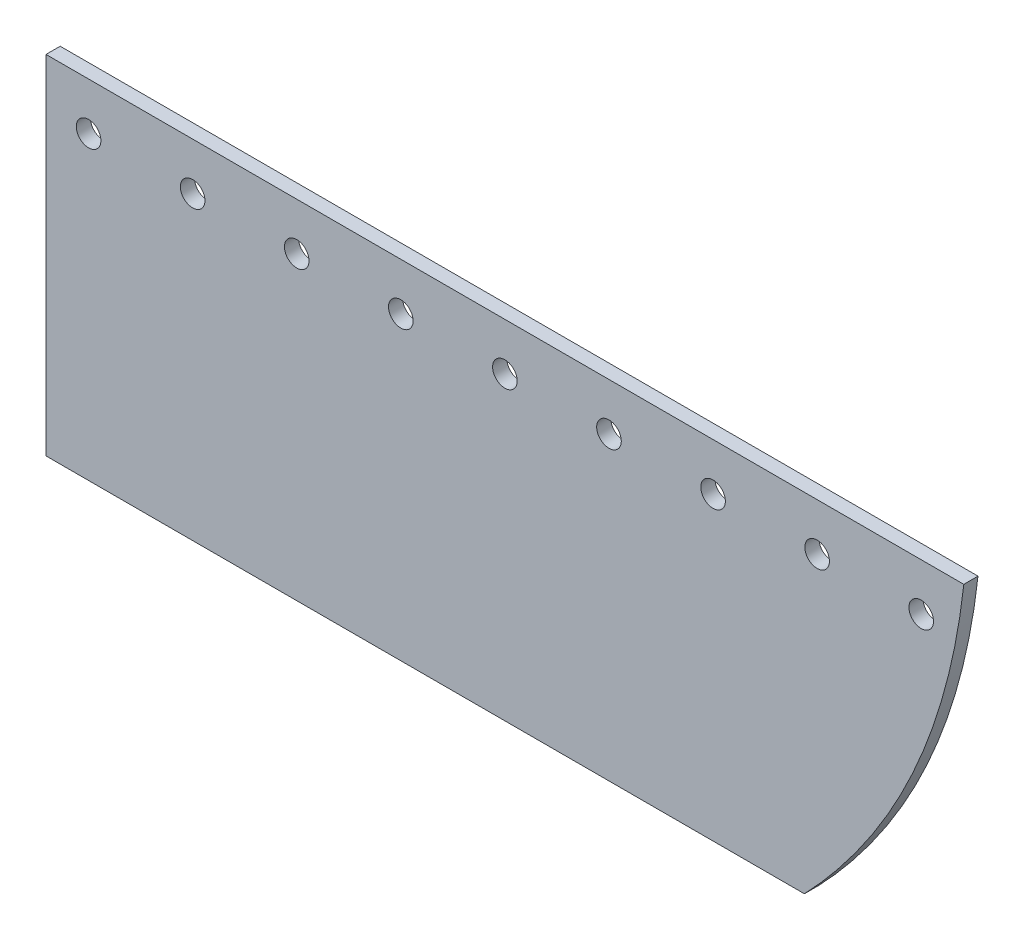
ISO-10303-21;
HEADER;
FILE_DESCRIPTION(('STEP AP214'),'2;1');
FILE_NAME('part.step','',(''),(''),'','','');
FILE_SCHEMA(('AUTOMOTIVE_DESIGN { 1 0 10303 214 1 1 1 1 }'));
ENDSEC;
DATA;
#1=APPLICATION_CONTEXT('core data for automotive mechanical design processes');
#2=APPLICATION_PROTOCOL_DEFINITION('international standard','automotive_design',2000,#1);
#3=PRODUCT_CONTEXT('',#1,'mechanical');
#4=PRODUCT('Part','Part','',(#3));
#5=PRODUCT_RELATED_PRODUCT_CATEGORY('part','',(#4));
#6=PRODUCT_DEFINITION_FORMATION('','',#4);
#7=PRODUCT_DEFINITION_CONTEXT('part definition',#1,'design');
#8=PRODUCT_DEFINITION('design','',#6,#7);
#9=PRODUCT_DEFINITION_SHAPE('','',#8);
#10=(LENGTH_UNIT() NAMED_UNIT(*) SI_UNIT(.MILLI.,.METRE.));
#11=(NAMED_UNIT(*) PLANE_ANGLE_UNIT() SI_UNIT($,.RADIAN.));
#12=(NAMED_UNIT(*) SI_UNIT($,.STERADIAN.) SOLID_ANGLE_UNIT());
#13=UNCERTAINTY_MEASURE_WITH_UNIT(LENGTH_MEASURE(1.E-05),#10,'distance_accuracy_value','');
#14=(GEOMETRIC_REPRESENTATION_CONTEXT(3) GLOBAL_UNCERTAINTY_ASSIGNED_CONTEXT((#13)) GLOBAL_UNIT_ASSIGNED_CONTEXT((#10,
#11,#12)) REPRESENTATION_CONTEXT('',''));
#15=CARTESIAN_POINT('',(0.,0.,0.));
#16=DIRECTION('',(0.,0.,1.));
#17=DIRECTION('',(1.,0.,0.));
#18=AXIS2_PLACEMENT_3D('',#15,#16,#17);
#19=CARTESIAN_POINT('',(-100.,36.75,3.));
#20=DIRECTION('',(0.,-1.,0.));
#21=DIRECTION('',(0.,0.,-1.));
#22=AXIS2_PLACEMENT_3D('',#19,#20,#21);
#23=PLANE('',#22);
#24=DIRECTION('',(-1.,0.,0.));
#25=VECTOR('',#24,1.);
#26=CARTESIAN_POINT('',(-100.,36.75,0.));
#27=LINE('',#26,#25);
#28=CARTESIAN_POINT('',(97.,36.75,0.));
#29=VERTEX_POINT('',#28);
#30=CARTESIAN_POINT('',(-97.,36.75,0.));
#31=VERTEX_POINT('',#30);
#32=EDGE_CURVE('E177',#29,#31,#27,.T.);
#33=ORIENTED_EDGE('',*,*,#32,.T.);
#34=DIRECTION('',(0.,0.,1.));
#35=VECTOR('',#34,1.);
#36=CARTESIAN_POINT('',(-97.,36.75,0.));
#37=LINE('',#36,#35);
#38=CARTESIAN_POINT('',(-97.,36.75,3.));
#39=VERTEX_POINT('',#38);
#40=EDGE_CURVE('E56',#31,#39,#37,.T.);
#41=ORIENTED_EDGE('',*,*,#40,.T.);
#42=DIRECTION('',(-1.,0.,0.));
#43=VECTOR('',#42,1.);
#44=CARTESIAN_POINT('',(-100.,36.75,3.));
#45=LINE('',#44,#43);
#46=CARTESIAN_POINT('',(97.,36.75,3.));
#47=VERTEX_POINT('',#46);
#48=EDGE_CURVE('E41',#47,#39,#45,.T.);
#49=ORIENTED_EDGE('',*,*,#48,.F.);
#50=DIRECTION('',(0.,0.,1.));
#51=VECTOR('',#50,1.);
#52=CARTESIAN_POINT('',(97.,36.75,0.));
#53=LINE('',#52,#51);
#54=EDGE_CURVE('E68',#29,#47,#53,.T.);
#55=ORIENTED_EDGE('',*,*,#54,.F.);
#56=EDGE_LOOP('',(#33,#41,#49,#55));
#57=FACE_BOUND('',#56,.T.);
#58=ADVANCED_FACE('F38',(#57),#23,.F.);
#59=CARTESIAN_POINT('',(-100.,-36.75,3.));
#60=DIRECTION('',(0.,1.,0.));
#61=DIRECTION('',(0.,0.,1.));
#62=AXIS2_PLACEMENT_3D('',#59,#60,#61);
#63=PLANE('',#62);
#64=DIRECTION('',(1.,0.,0.));
#65=VECTOR('',#64,1.);
#66=CARTESIAN_POINT('',(-100.,-36.75,0.));
#67=LINE('',#66,#65);
#68=CARTESIAN_POINT('',(-97.,-36.75,0.));
#69=VERTEX_POINT('',#68);
#70=CARTESIAN_POINT('',(63.3032073547046,-36.75,0.));
#71=VERTEX_POINT('',#70);
#72=EDGE_CURVE('E89',#69,#71,#67,.T.);
#73=ORIENTED_EDGE('',*,*,#72,.T.);
#74=DIRECTION('',(0.,0.,1.));
#75=VECTOR('',#74,1.);
#76=CARTESIAN_POINT('',(63.3032073547046,-36.75,0.));
#77=LINE('',#76,#75);
#78=CARTESIAN_POINT('',(63.3032073547046,-36.75,3.));
#79=VERTEX_POINT('',#78);
#80=EDGE_CURVE('E76',#71,#79,#77,.T.);
#81=ORIENTED_EDGE('',*,*,#80,.T.);
#82=DIRECTION('',(1.,0.,0.));
#83=VECTOR('',#82,1.);
#84=CARTESIAN_POINT('',(-100.,-36.75,3.));
#85=LINE('',#84,#83);
#86=CARTESIAN_POINT('',(-97.,-36.75,3.));
#87=VERTEX_POINT('',#86);
#88=EDGE_CURVE('E11',#87,#79,#85,.T.);
#89=ORIENTED_EDGE('',*,*,#88,.F.);
#90=DIRECTION('',(0.,0.,1.));
#91=VECTOR('',#90,1.);
#92=CARTESIAN_POINT('',(-97.,-36.75,0.));
#93=LINE('',#92,#91);
#94=EDGE_CURVE('E107',#69,#87,#93,.T.);
#95=ORIENTED_EDGE('',*,*,#94,.F.);
#96=EDGE_LOOP('',(#73,#81,#89,#95));
#97=FACE_BOUND('',#96,.T.);
#98=ADVANCED_FACE('F86',(#97),#63,.F.);
#99=CARTESIAN_POINT('',(0.,0.,3.));
#100=DIRECTION('',(0.,0.,1.));
#101=DIRECTION('',(1.,0.,0.));
#102=AXIS2_PLACEMENT_3D('',#99,#100,#101);
#103=PLANE('',#102);
#104=CARTESIAN_POINT('',(97.,36.75,3.));
#105=CARTESIAN_POINT('',(92.1890941569211,-6.5258786783424,3.));
#106=CARTESIAN_POINT('',(63.3032073547046,-36.75,3.));
#107=B_SPLINE_CURVE_WITH_KNOTS('',2,(#104,#105,#106),.UNSPECIFIED.,.F.,.F.,(3,3),(0.,1.),.UNSPECIFIED.);
#108=EDGE_CURVE('E73',#47,#79,#107,.T.);
#109=ORIENTED_EDGE('',*,*,#108,.F.);
#110=ORIENTED_EDGE('',*,*,#48,.T.);
#111=DIRECTION('',(0.,1.,0.));
#112=VECTOR('',#111,1.);
#113=CARTESIAN_POINT('',(-97.,0.,3.));
#114=LINE('',#113,#112);
#115=EDGE_CURVE('E96',#87,#39,#114,.T.);
#116=ORIENTED_EDGE('',*,*,#115,.F.);
#117=ORIENTED_EDGE('',*,*,#88,.T.);
#118=EDGE_LOOP('',(#109,#110,#116,#117));
#119=FACE_BOUND('',#118,.T.);
#120=CARTESIAN_POINT('',(-22.,26.75,3.));
#121=DIRECTION('',(0.,0.,1.));
#122=DIRECTION('',(1.,0.,0.));
#123=AXIS2_PLACEMENT_3D('',#120,#121,#122);
#124=CIRCLE('',#123,2.6);
#125=CARTESIAN_POINT('',(-19.4,26.75,3.));
#126=VERTEX_POINT('',#125);
#127=EDGE_CURVE('E120',#126,#126,#124,.T.);
#128=ORIENTED_EDGE('',*,*,#127,.F.);
#129=EDGE_LOOP('',(#128));
#130=FACE_BOUND('',#129,.T.);
#131=CARTESIAN_POINT('',(88.,26.75,3.));
#132=DIRECTION('',(0.,0.,1.));
#133=DIRECTION('',(1.,0.,0.));
#134=AXIS2_PLACEMENT_3D('',#131,#132,#133);
#135=CIRCLE('',#134,2.6);
#136=CARTESIAN_POINT('',(90.6,26.75,3.));
#137=VERTEX_POINT('',#136);
#138=EDGE_CURVE('E131',#137,#137,#135,.T.);
#139=ORIENTED_EDGE('',*,*,#138,.F.);
#140=EDGE_LOOP('',(#139));
#141=FACE_BOUND('',#140,.T.);
#142=CARTESIAN_POINT('',(66.,26.75,3.));
#143=DIRECTION('',(0.,0.,1.));
#144=DIRECTION('',(1.,0.,0.));
#145=AXIS2_PLACEMENT_3D('',#142,#143,#144);
#146=CIRCLE('',#145,2.6);
#147=CARTESIAN_POINT('',(68.6,26.75,3.));
#148=VERTEX_POINT('',#147);
#149=EDGE_CURVE('E140',#148,#148,#146,.T.);
#150=ORIENTED_EDGE('',*,*,#149,.F.);
#151=EDGE_LOOP('',(#150));
#152=FACE_BOUND('',#151,.T.);
#153=CARTESIAN_POINT('',(44.,26.75,3.));
#154=DIRECTION('',(0.,0.,1.));
#155=DIRECTION('',(1.,0.,0.));
#156=AXIS2_PLACEMENT_3D('',#153,#154,#155);
#157=CIRCLE('',#156,2.6);
#158=CARTESIAN_POINT('',(46.6,26.75,3.));
#159=VERTEX_POINT('',#158);
#160=EDGE_CURVE('E147',#159,#159,#157,.T.);
#161=ORIENTED_EDGE('',*,*,#160,.F.);
#162=EDGE_LOOP('',(#161));
#163=FACE_BOUND('',#162,.T.);
#164=CARTESIAN_POINT('',(-44.,26.75,3.));
#165=DIRECTION('',(0.,0.,1.));
#166=DIRECTION('',(1.,0.,0.));
#167=AXIS2_PLACEMENT_3D('',#164,#165,#166);
#168=CIRCLE('',#167,2.6);
#169=CARTESIAN_POINT('',(-41.4,26.75,3.));
#170=VERTEX_POINT('',#169);
#171=EDGE_CURVE('E111',#170,#170,#168,.T.);
#172=ORIENTED_EDGE('',*,*,#171,.F.);
#173=EDGE_LOOP('',(#172));
#174=FACE_BOUND('',#173,.T.);
#175=CARTESIAN_POINT('',(-66.,26.75,3.));
#176=DIRECTION('',(0.,0.,1.));
#177=DIRECTION('',(1.,0.,0.));
#178=AXIS2_PLACEMENT_3D('',#175,#176,#177);
#179=CIRCLE('',#178,2.6);
#180=CARTESIAN_POINT('',(-63.4,26.75,3.));
#181=VERTEX_POINT('',#180);
#182=EDGE_CURVE('E121',#181,#181,#179,.T.);
#183=ORIENTED_EDGE('',*,*,#182,.F.);
#184=EDGE_LOOP('',(#183));
#185=FACE_BOUND('',#184,.T.);
#186=CARTESIAN_POINT('',(-88.,26.75,3.));
#187=DIRECTION('',(0.,0.,1.));
#188=DIRECTION('',(1.,0.,0.));
#189=AXIS2_PLACEMENT_3D('',#186,#187,#188);
#190=CIRCLE('',#189,2.6);
#191=CARTESIAN_POINT('',(-85.4,26.75,3.));
#192=VERTEX_POINT('',#191);
#193=EDGE_CURVE('E100',#192,#192,#190,.T.);
#194=ORIENTED_EDGE('',*,*,#193,.F.);
#195=EDGE_LOOP('',(#194));
#196=FACE_BOUND('',#195,.T.);
#197=CARTESIAN_POINT('',(22.,26.75,3.));
#198=DIRECTION('',(0.,0.,1.));
#199=DIRECTION('',(1.,0.,0.));
#200=AXIS2_PLACEMENT_3D('',#197,#198,#199);
#201=CIRCLE('',#200,2.6);
#202=CARTESIAN_POINT('',(24.6,26.75,3.));
#203=VERTEX_POINT('',#202);
#204=EDGE_CURVE('E156',#203,#203,#201,.T.);
#205=ORIENTED_EDGE('',*,*,#204,.F.);
#206=EDGE_LOOP('',(#205));
#207=FACE_BOUND('',#206,.T.);
#208=CARTESIAN_POINT('',(0.,26.75,3.));
#209=DIRECTION('',(0.,0.,1.));
#210=DIRECTION('',(1.,0.,0.));
#211=AXIS2_PLACEMENT_3D('',#208,#209,#210);
#212=CIRCLE('',#211,2.6);
#213=CARTESIAN_POINT('',(2.59999999999997,26.75,3.));
#214=VERTEX_POINT('',#213);
#215=EDGE_CURVE('E174',#214,#214,#212,.T.);
#216=ORIENTED_EDGE('',*,*,#215,.F.);
#217=EDGE_LOOP('',(#216));
#218=FACE_BOUND('',#217,.T.);
#219=ADVANCED_FACE('F94',(#119,#130,#141,#152,#163,#174,#185,#196,#207,#218),#103,.T.);
#220=CARTESIAN_POINT('',(0.,0.,0.));
#221=DIRECTION('',(0.,0.,1.));
#222=DIRECTION('',(1.,0.,0.));
#223=AXIS2_PLACEMENT_3D('',#220,#221,#222);
#224=PLANE('',#223);
#225=CARTESIAN_POINT('',(-22.,26.75,0.));
#226=DIRECTION('',(0.,0.,1.));
#227=DIRECTION('',(1.,0.,0.));
#228=AXIS2_PLACEMENT_3D('',#225,#226,#227);
#229=CIRCLE('',#228,2.6);
#230=CARTESIAN_POINT('',(-19.4,26.75,0.));
#231=VERTEX_POINT('',#230);
#232=EDGE_CURVE('E136',#231,#231,#229,.T.);
#233=ORIENTED_EDGE('',*,*,#232,.T.);
#234=EDGE_LOOP('',(#233));
#235=FACE_BOUND('',#234,.T.);
#236=CARTESIAN_POINT('',(88.,26.75,0.));
#237=DIRECTION('',(0.,0.,1.));
#238=DIRECTION('',(1.,0.,0.));
#239=AXIS2_PLACEMENT_3D('',#236,#237,#238);
#240=CIRCLE('',#239,2.6);
#241=CARTESIAN_POINT('',(90.6,26.75,0.));
#242=VERTEX_POINT('',#241);
#243=EDGE_CURVE('E135',#242,#242,#240,.T.);
#244=ORIENTED_EDGE('',*,*,#243,.T.);
#245=EDGE_LOOP('',(#244));
#246=FACE_BOUND('',#245,.T.);
#247=CARTESIAN_POINT('',(66.,26.75,0.));
#248=DIRECTION('',(0.,0.,1.));
#249=DIRECTION('',(1.,0.,0.));
#250=AXIS2_PLACEMENT_3D('',#247,#248,#249);
#251=CIRCLE('',#250,2.6);
#252=CARTESIAN_POINT('',(68.6,26.75,0.));
#253=VERTEX_POINT('',#252);
#254=EDGE_CURVE('E152',#253,#253,#251,.T.);
#255=ORIENTED_EDGE('',*,*,#254,.T.);
#256=EDGE_LOOP('',(#255));
#257=FACE_BOUND('',#256,.T.);
#258=CARTESIAN_POINT('',(44.,26.75,0.));
#259=DIRECTION('',(0.,0.,1.));
#260=DIRECTION('',(1.,0.,0.));
#261=AXIS2_PLACEMENT_3D('',#258,#259,#260);
#262=CIRCLE('',#261,2.6);
#263=CARTESIAN_POINT('',(46.6,26.75,0.));
#264=VERTEX_POINT('',#263);
#265=EDGE_CURVE('E151',#264,#264,#262,.T.);
#266=ORIENTED_EDGE('',*,*,#265,.T.);
#267=EDGE_LOOP('',(#266));
#268=FACE_BOUND('',#267,.T.);
#269=CARTESIAN_POINT('',(-44.,26.75,0.));
#270=DIRECTION('',(0.,0.,1.));
#271=DIRECTION('',(1.,0.,0.));
#272=AXIS2_PLACEMENT_3D('',#269,#270,#271);
#273=CIRCLE('',#272,2.6);
#274=CARTESIAN_POINT('',(-41.4,26.75,0.));
#275=VERTEX_POINT('',#274);
#276=EDGE_CURVE('E115',#275,#275,#273,.T.);
#277=ORIENTED_EDGE('',*,*,#276,.T.);
#278=EDGE_LOOP('',(#277));
#279=FACE_BOUND('',#278,.T.);
#280=CARTESIAN_POINT('',(-66.,26.75,0.));
#281=DIRECTION('',(0.,0.,1.));
#282=DIRECTION('',(1.,0.,0.));
#283=AXIS2_PLACEMENT_3D('',#280,#281,#282);
#284=CIRCLE('',#283,2.6);
#285=CARTESIAN_POINT('',(-63.4,26.75,0.));
#286=VERTEX_POINT('',#285);
#287=EDGE_CURVE('E116',#286,#286,#284,.T.);
#288=ORIENTED_EDGE('',*,*,#287,.T.);
#289=EDGE_LOOP('',(#288));
#290=FACE_BOUND('',#289,.T.);
#291=CARTESIAN_POINT('',(-88.,26.75,0.));
#292=DIRECTION('',(0.,0.,1.));
#293=DIRECTION('',(1.,0.,0.));
#294=AXIS2_PLACEMENT_3D('',#291,#292,#293);
#295=CIRCLE('',#294,2.6);
#296=CARTESIAN_POINT('',(-85.4,26.75,0.));
#297=VERTEX_POINT('',#296);
#298=EDGE_CURVE('E105',#297,#297,#295,.T.);
#299=ORIENTED_EDGE('',*,*,#298,.T.);
#300=EDGE_LOOP('',(#299));
#301=FACE_BOUND('',#300,.T.);
#302=CARTESIAN_POINT('',(22.,26.75,0.));
#303=DIRECTION('',(0.,0.,1.));
#304=DIRECTION('',(1.,0.,0.));
#305=AXIS2_PLACEMENT_3D('',#302,#303,#304);
#306=CIRCLE('',#305,2.6);
#307=CARTESIAN_POINT('',(24.6,26.75,0.));
#308=VERTEX_POINT('',#307);
#309=EDGE_CURVE('E166',#308,#308,#306,.T.);
#310=ORIENTED_EDGE('',*,*,#309,.T.);
#311=EDGE_LOOP('',(#310));
#312=FACE_BOUND('',#311,.T.);
#313=CARTESIAN_POINT('',(0.,26.75,0.));
#314=DIRECTION('',(0.,0.,1.));
#315=DIRECTION('',(1.,0.,0.));
#316=AXIS2_PLACEMENT_3D('',#313,#314,#315);
#317=CIRCLE('',#316,2.6);
#318=CARTESIAN_POINT('',(2.59999999999997,26.75,0.));
#319=VERTEX_POINT('',#318);
#320=EDGE_CURVE('E170',#319,#319,#317,.T.);
#321=ORIENTED_EDGE('',*,*,#320,.T.);
#322=EDGE_LOOP('',(#321));
#323=FACE_BOUND('',#322,.T.);
#324=ORIENTED_EDGE('',*,*,#32,.F.);
#325=CARTESIAN_POINT('',(97.,36.75,0.));
#326=CARTESIAN_POINT('',(92.1890941569211,-6.52587867834239,0.));
#327=CARTESIAN_POINT('',(63.3032073547046,-36.75,0.));
#328=B_SPLINE_CURVE_WITH_KNOTS('',2,(#325,#326,#327),.UNSPECIFIED.,.F.,.F.,(3,3),(0.,1.),.UNSPECIFIED.);
#329=EDGE_CURVE('E91',#29,#71,#328,.T.);
#330=ORIENTED_EDGE('',*,*,#329,.T.);
#331=ORIENTED_EDGE('',*,*,#72,.F.);
#332=DIRECTION('',(0.,1.,0.));
#333=VECTOR('',#332,1.);
#334=CARTESIAN_POINT('',(-97.,36.75,0.));
#335=LINE('',#334,#333);
#336=EDGE_CURVE('E209',#69,#31,#335,.T.);
#337=ORIENTED_EDGE('',*,*,#336,.T.);
#338=EDGE_LOOP('',(#324,#330,#331,#337));
#339=FACE_BOUND('',#338,.T.);
#340=ADVANCED_FACE('F194',(#235,#246,#257,#268,#279,#290,#301,#312,#323,#339),#224,.F.);
#341=CARTESIAN_POINT('',(0.,26.75,0.));
#342=DIRECTION('',(0.,0.,1.));
#343=DIRECTION('',(1.,0.,0.));
#344=AXIS2_PLACEMENT_3D('',#341,#342,#343);
#345=CYLINDRICAL_SURFACE('',#344,2.6);
#346=ORIENTED_EDGE('',*,*,#215,.T.);
#347=EDGE_LOOP('',(#346));
#348=FACE_BOUND('',#347,.T.);
#349=ORIENTED_EDGE('',*,*,#320,.F.);
#350=EDGE_LOOP('',(#349));
#351=FACE_BOUND('',#350,.T.);
#352=ADVANCED_FACE('F195',(#348,#351),#345,.F.);
#353=CARTESIAN_POINT('',(22.,26.75,0.));
#354=DIRECTION('',(0.,0.,1.));
#355=DIRECTION('',(1.,0.,0.));
#356=AXIS2_PLACEMENT_3D('',#353,#354,#355);
#357=CYLINDRICAL_SURFACE('',#356,2.6);
#358=ORIENTED_EDGE('',*,*,#204,.T.);
#359=EDGE_LOOP('',(#358));
#360=FACE_BOUND('',#359,.T.);
#361=ORIENTED_EDGE('',*,*,#309,.F.);
#362=EDGE_LOOP('',(#361));
#363=FACE_BOUND('',#362,.T.);
#364=ADVANCED_FACE('F243',(#360,#363),#357,.F.);
#365=CARTESIAN_POINT('',(-88.,26.75,0.));
#366=DIRECTION('',(0.,0.,1.));
#367=DIRECTION('',(1.,0.,0.));
#368=AXIS2_PLACEMENT_3D('',#365,#366,#367);
#369=CYLINDRICAL_SURFACE('',#368,2.6);
#370=ORIENTED_EDGE('',*,*,#193,.T.);
#371=EDGE_LOOP('',(#370));
#372=FACE_BOUND('',#371,.T.);
#373=ORIENTED_EDGE('',*,*,#298,.F.);
#374=EDGE_LOOP('',(#373));
#375=FACE_BOUND('',#374,.T.);
#376=ADVANCED_FACE('F239',(#372,#375),#369,.F.);
#377=CARTESIAN_POINT('',(-66.,26.75,0.));
#378=DIRECTION('',(0.,0.,1.));
#379=DIRECTION('',(1.,0.,0.));
#380=AXIS2_PLACEMENT_3D('',#377,#378,#379);
#381=CYLINDRICAL_SURFACE('',#380,2.6);
#382=ORIENTED_EDGE('',*,*,#182,.T.);
#383=EDGE_LOOP('',(#382));
#384=FACE_BOUND('',#383,.T.);
#385=ORIENTED_EDGE('',*,*,#287,.F.);
#386=EDGE_LOOP('',(#385));
#387=FACE_BOUND('',#386,.T.);
#388=ADVANCED_FACE('F235',(#384,#387),#381,.F.);
#389=CARTESIAN_POINT('',(-44.,26.75,0.));
#390=DIRECTION('',(0.,0.,1.));
#391=DIRECTION('',(1.,0.,0.));
#392=AXIS2_PLACEMENT_3D('',#389,#390,#391);
#393=CYLINDRICAL_SURFACE('',#392,2.6);
#394=ORIENTED_EDGE('',*,*,#171,.T.);
#395=EDGE_LOOP('',(#394));
#396=FACE_BOUND('',#395,.T.);
#397=ORIENTED_EDGE('',*,*,#276,.F.);
#398=EDGE_LOOP('',(#397));
#399=FACE_BOUND('',#398,.T.);
#400=ADVANCED_FACE('F231',(#396,#399),#393,.F.);
#401=CARTESIAN_POINT('',(44.,26.75,0.));
#402=DIRECTION('',(0.,0.,1.));
#403=DIRECTION('',(1.,0.,0.));
#404=AXIS2_PLACEMENT_3D('',#401,#402,#403);
#405=CYLINDRICAL_SURFACE('',#404,2.6);
#406=ORIENTED_EDGE('',*,*,#160,.T.);
#407=EDGE_LOOP('',(#406));
#408=FACE_BOUND('',#407,.T.);
#409=ORIENTED_EDGE('',*,*,#265,.F.);
#410=EDGE_LOOP('',(#409));
#411=FACE_BOUND('',#410,.T.);
#412=ADVANCED_FACE('F234',(#408,#411),#405,.F.);
#413=CARTESIAN_POINT('',(66.,26.75,0.));
#414=DIRECTION('',(0.,0.,1.));
#415=DIRECTION('',(1.,0.,0.));
#416=AXIS2_PLACEMENT_3D('',#413,#414,#415);
#417=CYLINDRICAL_SURFACE('',#416,2.6);
#418=ORIENTED_EDGE('',*,*,#149,.T.);
#419=EDGE_LOOP('',(#418));
#420=FACE_BOUND('',#419,.T.);
#421=ORIENTED_EDGE('',*,*,#254,.F.);
#422=EDGE_LOOP('',(#421));
#423=FACE_BOUND('',#422,.T.);
#424=ADVANCED_FACE('F248',(#420,#423),#417,.F.);
#425=CARTESIAN_POINT('',(88.,26.75,0.));
#426=DIRECTION('',(0.,0.,1.));
#427=DIRECTION('',(1.,0.,0.));
#428=AXIS2_PLACEMENT_3D('',#425,#426,#427);
#429=CYLINDRICAL_SURFACE('',#428,2.6);
#430=ORIENTED_EDGE('',*,*,#138,.T.);
#431=EDGE_LOOP('',(#430));
#432=FACE_BOUND('',#431,.T.);
#433=ORIENTED_EDGE('',*,*,#243,.F.);
#434=EDGE_LOOP('',(#433));
#435=FACE_BOUND('',#434,.T.);
#436=ADVANCED_FACE('F245',(#432,#435),#429,.F.);
#437=CARTESIAN_POINT('',(-22.,26.75,0.));
#438=DIRECTION('',(0.,0.,1.));
#439=DIRECTION('',(1.,0.,0.));
#440=AXIS2_PLACEMENT_3D('',#437,#438,#439);
#441=CYLINDRICAL_SURFACE('',#440,2.6);
#442=ORIENTED_EDGE('',*,*,#127,.T.);
#443=EDGE_LOOP('',(#442));
#444=FACE_BOUND('',#443,.T.);
#445=ORIENTED_EDGE('',*,*,#232,.F.);
#446=EDGE_LOOP('',(#445));
#447=FACE_BOUND('',#446,.T.);
#448=ADVANCED_FACE('F230',(#444,#447),#441,.F.);
#449=CARTESIAN_POINT('',(-97.,36.75,0.));
#450=DIRECTION('',(1.,0.,0.));
#451=DIRECTION('',(0.,0.,-1.));
#452=AXIS2_PLACEMENT_3D('',#449,#450,#451);
#453=PLANE('',#452);
#454=ORIENTED_EDGE('',*,*,#115,.T.);
#455=ORIENTED_EDGE('',*,*,#40,.F.);
#456=ORIENTED_EDGE('',*,*,#336,.F.);
#457=ORIENTED_EDGE('',*,*,#94,.T.);
#458=EDGE_LOOP('',(#454,#455,#456,#457));
#459=FACE_BOUND('',#458,.T.);
#460=ADVANCED_FACE('F212',(#459),#453,.F.);
#461=DIRECTION('',(0.,0.,1.));
#462=VECTOR('',#461,1.);
#463=SURFACE_OF_LINEAR_EXTRUSION('',#328,#462);
#464=ORIENTED_EDGE('',*,*,#108,.T.);
#465=ORIENTED_EDGE('',*,*,#80,.F.);
#466=ORIENTED_EDGE('',*,*,#329,.F.);
#467=ORIENTED_EDGE('',*,*,#54,.T.);
#468=EDGE_LOOP('',(#464,#465,#466,#467));
#469=FACE_BOUND('',#468,.T.);
#470=ADVANCED_FACE('F75',(#469),#463,.F.);
#471=CLOSED_SHELL('',(#58,#98,#219,#340,#352,#364,#376,#388,#400,#412,#424,#436,#448,#460,#470));
#472=MANIFOLD_SOLID_BREP('B2',#471);
#473=ADVANCED_BREP_SHAPE_REPRESENTATION('',(#18,#472),#14);
#474=SHAPE_DEFINITION_REPRESENTATION(#9,#473);
ENDSEC;
END-ISO-10303-21;
